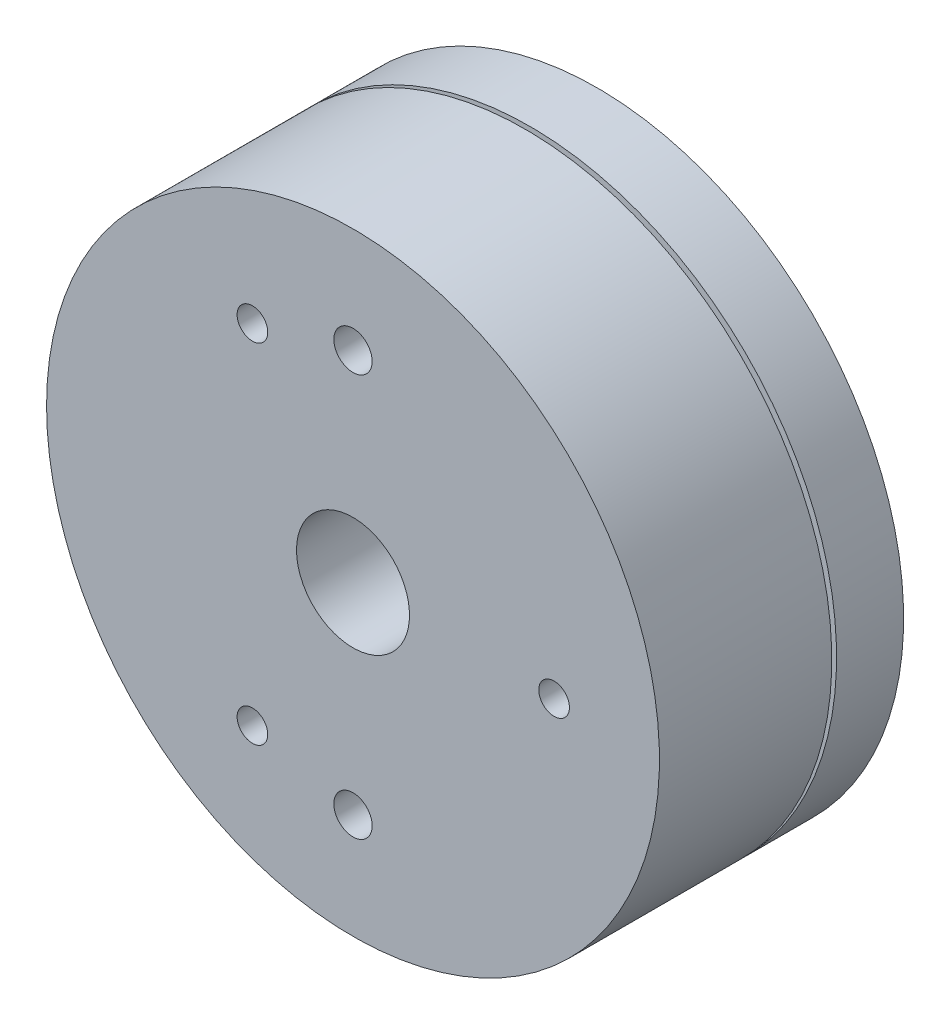
ISO-10303-21;
HEADER;
FILE_DESCRIPTION(('STEP AP214'),'2;1');
FILE_NAME('part.step','',(''),(''),'','','');
FILE_SCHEMA(('AUTOMOTIVE_DESIGN { 1 0 10303 214 1 1 1 1 }'));
ENDSEC;
DATA;
#1=APPLICATION_CONTEXT('core data for automotive mechanical design processes');
#2=APPLICATION_PROTOCOL_DEFINITION('international standard','automotive_design',2000,#1);
#3=PRODUCT_CONTEXT('',#1,'mechanical');
#4=PRODUCT('Part','Part','',(#3));
#5=PRODUCT_RELATED_PRODUCT_CATEGORY('part','',(#4));
#6=PRODUCT_DEFINITION_FORMATION('','',#4);
#7=PRODUCT_DEFINITION_CONTEXT('part definition',#1,'design');
#8=PRODUCT_DEFINITION('design','',#6,#7);
#9=PRODUCT_DEFINITION_SHAPE('','',#8);
#10=(LENGTH_UNIT() NAMED_UNIT(*) SI_UNIT(.MILLI.,.METRE.));
#11=(NAMED_UNIT(*) PLANE_ANGLE_UNIT() SI_UNIT($,.RADIAN.));
#12=(NAMED_UNIT(*) SI_UNIT($,.STERADIAN.) SOLID_ANGLE_UNIT());
#13=UNCERTAINTY_MEASURE_WITH_UNIT(LENGTH_MEASURE(1.E-05),#10,'distance_accuracy_value','');
#14=(GEOMETRIC_REPRESENTATION_CONTEXT(3) GLOBAL_UNCERTAINTY_ASSIGNED_CONTEXT((#13)) GLOBAL_UNIT_ASSIGNED_CONTEXT((#10,
#11,#12)) REPRESENTATION_CONTEXT('',''));
#15=CARTESIAN_POINT('',(0.,0.,0.));
#16=DIRECTION('',(0.,0.,1.));
#17=DIRECTION('',(1.,0.,0.));
#18=AXIS2_PLACEMENT_3D('',#15,#16,#17);
#19=CARTESIAN_POINT('',(0.,0.,3.75));
#20=DIRECTION('',(0.,0.,1.));
#21=DIRECTION('',(1.,0.,0.));
#22=AXIS2_PLACEMENT_3D('',#19,#20,#21);
#23=PLANE('',#22);
#24=CARTESIAN_POINT('',(0.,0.,3.75));
#25=DIRECTION('',(0.,0.,1.));
#26=DIRECTION('',(1.,0.,0.));
#27=AXIS2_PLACEMENT_3D('',#24,#25,#26);
#28=CIRCLE('',#27,5.75);
#29=CARTESIAN_POINT('',(-5.75,0.,3.75));
#30=VERTEX_POINT('',#29);
#31=EDGE_CURVE('P0_E182',#30,#30,#28,.T.);
#32=ORIENTED_EDGE('',*,*,#31,.T.);
#33=EDGE_LOOP('',(#32));
#34=FACE_BOUND('',#33,.T.);
#35=CARTESIAN_POINT('',(0.,-10.5,3.75));
#36=DIRECTION('',(0.,0.,1.));
#37=DIRECTION('',(1.,0.,0.));
#38=AXIS2_PLACEMENT_3D('',#35,#36,#37);
#39=CIRCLE('',#38,1.);
#40=CARTESIAN_POINT('',(-1.,-10.5,3.75));
#41=VERTEX_POINT('',#40);
#42=EDGE_CURVE('P0_E178',#41,#41,#39,.T.);
#43=ORIENTED_EDGE('',*,*,#42,.T.);
#44=EDGE_LOOP('',(#43));
#45=FACE_BOUND('',#44,.T.);
#46=CARTESIAN_POINT('',(0.,10.5,3.75));
#47=DIRECTION('',(0.,0.,1.));
#48=DIRECTION('',(1.,0.,0.));
#49=AXIS2_PLACEMENT_3D('',#46,#47,#48);
#50=CIRCLE('',#49,1.);
#51=CARTESIAN_POINT('',(-1.,10.5,3.75));
#52=VERTEX_POINT('',#51);
#53=EDGE_CURVE('P0_E135',#52,#52,#50,.T.);
#54=ORIENTED_EDGE('',*,*,#53,.T.);
#55=EDGE_LOOP('',(#54));
#56=FACE_BOUND('',#55,.T.);
#57=CARTESIAN_POINT('',(10.5,0.,3.75));
#58=DIRECTION('',(0.,0.,1.));
#59=DIRECTION('',(1.,0.,0.));
#60=AXIS2_PLACEMENT_3D('',#57,#58,#59);
#61=CIRCLE('',#60,0.8);
#62=CARTESIAN_POINT('',(9.7,0.,3.75));
#63=VERTEX_POINT('',#62);
#64=EDGE_CURVE('P0_E126',#63,#63,#61,.T.);
#65=ORIENTED_EDGE('',*,*,#64,.T.);
#66=EDGE_LOOP('',(#65));
#67=FACE_BOUND('',#66,.T.);
#68=CARTESIAN_POINT('',(-5.25,9.09326673973662,3.75));
#69=DIRECTION('',(0.,0.,1.));
#70=DIRECTION('',(1.,0.,0.));
#71=AXIS2_PLACEMENT_3D('',#68,#69,#70);
#72=CIRCLE('',#71,0.8);
#73=CARTESIAN_POINT('',(-6.05,9.09326673973662,3.75));
#74=VERTEX_POINT('',#73);
#75=EDGE_CURVE('P0_E139',#74,#74,#72,.T.);
#76=ORIENTED_EDGE('',*,*,#75,.T.);
#77=EDGE_LOOP('',(#76));
#78=FACE_BOUND('',#77,.T.);
#79=CARTESIAN_POINT('',(-5.25,-9.09326673973659,3.75));
#80=DIRECTION('',(0.,0.,1.));
#81=DIRECTION('',(1.,0.,0.));
#82=AXIS2_PLACEMENT_3D('',#79,#80,#81);
#83=CIRCLE('',#82,0.8);
#84=CARTESIAN_POINT('',(-6.05,-9.09326673973659,3.75));
#85=VERTEX_POINT('',#84);
#86=EDGE_CURVE('P0_E109',#85,#85,#83,.T.);
#87=ORIENTED_EDGE('',*,*,#86,.T.);
#88=EDGE_LOOP('',(#87));
#89=FACE_BOUND('',#88,.T.);
#90=CARTESIAN_POINT('',(0.,0.,3.75));
#91=DIRECTION('',(0.,0.,-1.));
#92=DIRECTION('',(1.,0.,0.));
#93=AXIS2_PLACEMENT_3D('',#90,#91,#92);
#94=CIRCLE('',#93,16.);
#95=CARTESIAN_POINT('',(-16.,0.,3.75));
#96=VERTEX_POINT('',#95);
#97=EDGE_CURVE('P0_E140',#96,#96,#94,.T.);
#98=ORIENTED_EDGE('',*,*,#97,.T.);
#99=EDGE_LOOP('',(#98));
#100=FACE_BOUND('',#99,.T.);
#101=ADVANCED_FACE('P0_F16',(#34,#45,#56,#67,#78,#89,#100),#23,.F.);
#102=CARTESIAN_POINT('',(0.,0.,12.75));
#103=DIRECTION('',(0.,0.,1.));
#104=DIRECTION('',(1.,0.,0.));
#105=AXIS2_PLACEMENT_3D('',#102,#103,#104);
#106=PLANE('',#105);
#107=CARTESIAN_POINT('',(0.,-10.5,12.75));
#108=DIRECTION('',(0.,0.,-1.));
#109=DIRECTION('',(1.,0.,0.));
#110=AXIS2_PLACEMENT_3D('',#107,#108,#109);
#111=CIRCLE('',#110,1.);
#112=CARTESIAN_POINT('',(-1.,-10.5,12.75));
#113=VERTEX_POINT('',#112);
#114=EDGE_CURVE('P0_E150',#113,#113,#111,.T.);
#115=ORIENTED_EDGE('',*,*,#114,.T.);
#116=EDGE_LOOP('',(#115));
#117=FACE_BOUND('',#116,.T.);
#118=CARTESIAN_POINT('',(0.,10.5,12.75));
#119=DIRECTION('',(0.,0.,-1.));
#120=DIRECTION('',(1.,0.,0.));
#121=AXIS2_PLACEMENT_3D('',#118,#119,#120);
#122=CIRCLE('',#121,1.);
#123=CARTESIAN_POINT('',(-1.,10.5,12.75));
#124=VERTEX_POINT('',#123);
#125=EDGE_CURVE('P0_E131',#124,#124,#122,.T.);
#126=ORIENTED_EDGE('',*,*,#125,.T.);
#127=EDGE_LOOP('',(#126));
#128=FACE_BOUND('',#127,.T.);
#129=CARTESIAN_POINT('',(10.5,0.,12.75));
#130=DIRECTION('',(0.,0.,-1.));
#131=DIRECTION('',(1.,0.,0.));
#132=AXIS2_PLACEMENT_3D('',#129,#130,#131);
#133=CIRCLE('',#132,0.8);
#134=CARTESIAN_POINT('',(9.7,0.,12.75));
#135=VERTEX_POINT('',#134);
#136=EDGE_CURVE('P0_E100',#135,#135,#133,.T.);
#137=ORIENTED_EDGE('',*,*,#136,.T.);
#138=EDGE_LOOP('',(#137));
#139=FACE_BOUND('',#138,.T.);
#140=CARTESIAN_POINT('',(-5.25,9.09326673973662,12.75));
#141=DIRECTION('',(0.,0.,-1.));
#142=DIRECTION('',(1.,0.,0.));
#143=AXIS2_PLACEMENT_3D('',#140,#141,#142);
#144=CIRCLE('',#143,0.8);
#145=CARTESIAN_POINT('',(-6.05,9.09326673973662,12.75));
#146=VERTEX_POINT('',#145);
#147=EDGE_CURVE('P0_E115',#146,#146,#144,.T.);
#148=ORIENTED_EDGE('',*,*,#147,.T.);
#149=EDGE_LOOP('',(#148));
#150=FACE_BOUND('',#149,.T.);
#151=CARTESIAN_POINT('',(-5.25,-9.09326673973659,12.75));
#152=DIRECTION('',(0.,0.,-1.));
#153=DIRECTION('',(1.,0.,0.));
#154=AXIS2_PLACEMENT_3D('',#151,#152,#153);
#155=CIRCLE('',#154,0.8);
#156=CARTESIAN_POINT('',(-6.05,-9.09326673973659,12.75));
#157=VERTEX_POINT('',#156);
#158=EDGE_CURVE('P0_E110',#157,#157,#155,.T.);
#159=ORIENTED_EDGE('',*,*,#158,.T.);
#160=EDGE_LOOP('',(#159));
#161=FACE_BOUND('',#160,.T.);
#162=CARTESIAN_POINT('',(0.,0.,12.75));
#163=DIRECTION('',(0.,0.,-1.));
#164=DIRECTION('',(1.,0.,0.));
#165=AXIS2_PLACEMENT_3D('',#162,#163,#164);
#166=CIRCLE('',#165,2.95);
#167=CARTESIAN_POINT('',(-2.95,0.,12.75));
#168=VERTEX_POINT('',#167);
#169=EDGE_CURVE('P0_E148',#168,#168,#166,.T.);
#170=ORIENTED_EDGE('',*,*,#169,.T.);
#171=EDGE_LOOP('',(#170));
#172=FACE_BOUND('',#171,.T.);
#173=CARTESIAN_POINT('',(0.,0.,12.75));
#174=DIRECTION('',(0.,0.,1.));
#175=DIRECTION('',(1.,0.,0.));
#176=AXIS2_PLACEMENT_3D('',#173,#174,#175);
#177=CIRCLE('',#176,16.);
#178=CARTESIAN_POINT('',(-16.,0.,12.75));
#179=VERTEX_POINT('',#178);
#180=EDGE_CURVE('P0_E11',#179,#179,#177,.T.);
#181=ORIENTED_EDGE('',*,*,#180,.T.);
#182=EDGE_LOOP('',(#181));
#183=FACE_BOUND('',#182,.T.);
#184=ADVANCED_FACE('P0_F193',(#117,#128,#139,#150,#161,#172,#183),#106,.T.);
#185=CARTESIAN_POINT('',(0.,0.,12.75));
#186=DIRECTION('',(0.,0.,-1.));
#187=DIRECTION('',(1.,0.,0.));
#188=AXIS2_PLACEMENT_3D('',#185,#186,#187);
#189=CYLINDRICAL_SURFACE('',#188,16.);
#190=ORIENTED_EDGE('',*,*,#97,.F.);
#191=DIRECTION('',(0.,0.,1.));
#192=VECTOR('',#191,1.);
#193=CARTESIAN_POINT('',(-16.,0.,12.75));
#194=LINE('',#193,#192);
#195=EDGE_CURVE('P0_E27',#96,#179,#194,.T.);
#196=ORIENTED_EDGE('',*,*,#195,.T.);
#197=ORIENTED_EDGE('',*,*,#180,.F.);
#198=ORIENTED_EDGE('',*,*,#195,.F.);
#199=EDGE_LOOP('',(#190,#196,#197,#198));
#200=FACE_BOUND('',#199,.T.);
#201=ADVANCED_FACE('P0_F191',(#200),#189,.T.);
#202=CARTESIAN_POINT('',(-5.25,-9.09326673973659,12.75));
#203=DIRECTION('',(0.,0.,-1.));
#204=DIRECTION('',(1.,0.,0.));
#205=AXIS2_PLACEMENT_3D('',#202,#203,#204);
#206=CYLINDRICAL_SURFACE('',#205,0.8);
#207=ORIENTED_EDGE('',*,*,#86,.F.);
#208=DIRECTION('',(0.,0.,1.));
#209=VECTOR('',#208,1.);
#210=CARTESIAN_POINT('',(-6.05,-9.09326673973659,12.75));
#211=LINE('',#210,#209);
#212=EDGE_CURVE('P0_E20',#85,#157,#211,.T.);
#213=ORIENTED_EDGE('',*,*,#212,.T.);
#214=ORIENTED_EDGE('',*,*,#158,.F.);
#215=ORIENTED_EDGE('',*,*,#212,.F.);
#216=EDGE_LOOP('',(#207,#213,#214,#215));
#217=FACE_BOUND('',#216,.T.);
#218=ADVANCED_FACE('P0_F18',(#217),#206,.F.);
#219=CARTESIAN_POINT('',(-5.25,9.09326673973662,12.75));
#220=DIRECTION('',(0.,0.,-1.));
#221=DIRECTION('',(1.,0.,0.));
#222=AXIS2_PLACEMENT_3D('',#219,#220,#221);
#223=CYLINDRICAL_SURFACE('',#222,0.8);
#224=ORIENTED_EDGE('',*,*,#75,.F.);
#225=DIRECTION('',(0.,0.,1.));
#226=VECTOR('',#225,1.);
#227=CARTESIAN_POINT('',(-6.05,9.09326673973662,12.75));
#228=LINE('',#227,#226);
#229=EDGE_CURVE('P0_E90',#74,#146,#228,.T.);
#230=ORIENTED_EDGE('',*,*,#229,.T.);
#231=ORIENTED_EDGE('',*,*,#147,.F.);
#232=ORIENTED_EDGE('',*,*,#229,.F.);
#233=EDGE_LOOP('',(#224,#230,#231,#232));
#234=FACE_BOUND('',#233,.T.);
#235=ADVANCED_FACE('P0_F216',(#234),#223,.F.);
#236=CARTESIAN_POINT('',(10.5,0.,12.75));
#237=DIRECTION('',(0.,0.,-1.));
#238=DIRECTION('',(1.,0.,0.));
#239=AXIS2_PLACEMENT_3D('',#236,#237,#238);
#240=CYLINDRICAL_SURFACE('',#239,0.8);
#241=ORIENTED_EDGE('',*,*,#64,.F.);
#242=DIRECTION('',(0.,0.,1.));
#243=VECTOR('',#242,1.);
#244=CARTESIAN_POINT('',(9.7,0.,12.75));
#245=LINE('',#244,#243);
#246=EDGE_CURVE('P0_E130',#63,#135,#245,.T.);
#247=ORIENTED_EDGE('',*,*,#246,.T.);
#248=ORIENTED_EDGE('',*,*,#136,.F.);
#249=ORIENTED_EDGE('',*,*,#246,.F.);
#250=EDGE_LOOP('',(#241,#247,#248,#249));
#251=FACE_BOUND('',#250,.T.);
#252=ADVANCED_FACE('P0_F211',(#251),#240,.F.);
#253=CARTESIAN_POINT('',(0.,10.5,12.75));
#254=DIRECTION('',(0.,0.,-1.));
#255=DIRECTION('',(1.,0.,0.));
#256=AXIS2_PLACEMENT_3D('',#253,#254,#255);
#257=CYLINDRICAL_SURFACE('',#256,1.);
#258=ORIENTED_EDGE('',*,*,#53,.F.);
#259=DIRECTION('',(0.,0.,1.));
#260=VECTOR('',#259,1.);
#261=CARTESIAN_POINT('',(-1.,10.5,12.75));
#262=LINE('',#261,#260);
#263=EDGE_CURVE('P0_E132',#52,#124,#262,.T.);
#264=ORIENTED_EDGE('',*,*,#263,.T.);
#265=ORIENTED_EDGE('',*,*,#125,.F.);
#266=ORIENTED_EDGE('',*,*,#263,.F.);
#267=EDGE_LOOP('',(#258,#264,#265,#266));
#268=FACE_BOUND('',#267,.T.);
#269=ADVANCED_FACE('P0_F165',(#268),#257,.F.);
#270=CARTESIAN_POINT('',(0.,-10.5,12.75));
#271=DIRECTION('',(0.,0.,-1.));
#272=DIRECTION('',(1.,0.,0.));
#273=AXIS2_PLACEMENT_3D('',#270,#271,#272);
#274=CYLINDRICAL_SURFACE('',#273,1.);
#275=ORIENTED_EDGE('',*,*,#42,.F.);
#276=DIRECTION('',(0.,0.,1.));
#277=VECTOR('',#276,1.);
#278=CARTESIAN_POINT('',(-1.,-10.5,12.75));
#279=LINE('',#278,#277);
#280=EDGE_CURVE('P0_E153',#41,#113,#279,.T.);
#281=ORIENTED_EDGE('',*,*,#280,.T.);
#282=ORIENTED_EDGE('',*,*,#114,.F.);
#283=ORIENTED_EDGE('',*,*,#280,.F.);
#284=EDGE_LOOP('',(#275,#281,#282,#283));
#285=FACE_BOUND('',#284,.T.);
#286=ADVANCED_FACE('P0_F210',(#285),#274,.F.);
#287=CARTESIAN_POINT('',(0.,0.,-2.25));
#288=DIRECTION('',(0.,0.,1.));
#289=DIRECTION('',(1.,0.,0.));
#290=AXIS2_PLACEMENT_3D('',#287,#288,#289);
#291=PLANE('',#290);
#292=CARTESIAN_POINT('',(0.,0.,-2.25));
#293=DIRECTION('',(0.,0.,1.));
#294=DIRECTION('',(1.,0.,0.));
#295=AXIS2_PLACEMENT_3D('',#292,#293,#294);
#296=CIRCLE('',#295,2.95);
#297=CARTESIAN_POINT('',(-2.95,0.,-2.25));
#298=VERTEX_POINT('',#297);
#299=EDGE_CURVE('P0_E149',#298,#298,#296,.T.);
#300=ORIENTED_EDGE('',*,*,#299,.T.);
#301=EDGE_LOOP('',(#300));
#302=FACE_BOUND('',#301,.T.);
#303=CARTESIAN_POINT('',(0.,0.,-2.25));
#304=DIRECTION('',(0.,0.,-1.));
#305=DIRECTION('',(1.,0.,0.));
#306=AXIS2_PLACEMENT_3D('',#303,#304,#305);
#307=CIRCLE('',#306,5.75);
#308=CARTESIAN_POINT('',(-5.75,0.,-2.25));
#309=VERTEX_POINT('',#308);
#310=EDGE_CURVE('P0_E154',#309,#309,#307,.T.);
#311=ORIENTED_EDGE('',*,*,#310,.T.);
#312=EDGE_LOOP('',(#311));
#313=FACE_BOUND('',#312,.T.);
#314=ADVANCED_FACE('P0_F221',(#302,#313),#291,.F.);
#315=CARTESIAN_POINT('',(0.,0.,12.75));
#316=DIRECTION('',(0.,0.,-1.));
#317=DIRECTION('',(1.,0.,0.));
#318=AXIS2_PLACEMENT_3D('',#315,#316,#317);
#319=CYLINDRICAL_SURFACE('',#318,2.95);
#320=ORIENTED_EDGE('',*,*,#299,.F.);
#321=DIRECTION('',(0.,0.,1.));
#322=VECTOR('',#321,1.);
#323=CARTESIAN_POINT('',(-2.95,0.,12.75));
#324=LINE('',#323,#322);
#325=EDGE_CURVE('P0_E144',#298,#168,#324,.T.);
#326=ORIENTED_EDGE('',*,*,#325,.T.);
#327=ORIENTED_EDGE('',*,*,#169,.F.);
#328=ORIENTED_EDGE('',*,*,#325,.F.);
#329=EDGE_LOOP('',(#320,#326,#327,#328));
#330=FACE_BOUND('',#329,.T.);
#331=ADVANCED_FACE('P0_F218',(#330),#319,.F.);
#332=CARTESIAN_POINT('',(0.,0.,12.75));
#333=DIRECTION('',(0.,0.,-1.));
#334=DIRECTION('',(1.,0.,0.));
#335=AXIS2_PLACEMENT_3D('',#332,#333,#334);
#336=CYLINDRICAL_SURFACE('',#335,5.75);
#337=ORIENTED_EDGE('',*,*,#310,.F.);
#338=DIRECTION('',(0.,0.,1.));
#339=VECTOR('',#338,1.);
#340=CARTESIAN_POINT('',(-5.75,0.,12.75));
#341=LINE('',#340,#339);
#342=EDGE_CURVE('P0_E123',#309,#30,#341,.T.);
#343=ORIENTED_EDGE('',*,*,#342,.T.);
#344=ORIENTED_EDGE('',*,*,#31,.F.);
#345=ORIENTED_EDGE('',*,*,#342,.F.);
#346=EDGE_LOOP('',(#337,#343,#344,#345));
#347=FACE_BOUND('',#346,.T.);
#348=ADVANCED_FACE('P0_F205',(#347),#336,.T.);
#349=CLOSED_SHELL('',(#101,#184,#201,#218,#235,#252,#269,#286,#314,#331,#348));
#350=MANIFOLD_SOLID_BREP('P0_B1',#349);
#351=CARTESIAN_POINT('',(0.,0.,0.));
#352=DIRECTION('',(0.,0.,1.));
#353=DIRECTION('',(1.,0.,0.));
#354=AXIS2_PLACEMENT_3D('',#351,#352,#353);
#355=PLANE('',#354);
#356=DIRECTION('',(0.,-1.,0.));
#357=VECTOR('',#356,1.);
#358=CARTESIAN_POINT('',(-9.,4.,0.));
#359=LINE('',#358,#357);
#360=CARTESIAN_POINT('',(-9.,4.,0.));
#361=VERTEX_POINT('',#360);
#362=CARTESIAN_POINT('',(-9.,-4.,0.));
#363=VERTEX_POINT('',#362);
#364=EDGE_CURVE('P1_E71',#361,#363,#359,.T.);
#365=ORIENTED_EDGE('',*,*,#364,.F.);
#366=DIRECTION('',(1.,0.,0.));
#367=VECTOR('',#366,1.);
#368=CARTESIAN_POINT('',(-12.3,4.,0.));
#369=LINE('',#368,#367);
#370=CARTESIAN_POINT('',(-12.3,4.,0.));
#371=VERTEX_POINT('',#370);
#372=EDGE_CURVE('P1_E146',#371,#361,#369,.T.);
#373=ORIENTED_EDGE('',*,*,#372,.F.);
#374=DIRECTION('',(0.,1.,0.));
#375=VECTOR('',#374,1.);
#376=CARTESIAN_POINT('',(-12.3,-4.,0.));
#377=LINE('',#376,#375);
#378=CARTESIAN_POINT('',(-12.3,-4.,0.));
#379=VERTEX_POINT('',#378);
#380=EDGE_CURVE('P1_E61',#379,#371,#377,.T.);
#381=ORIENTED_EDGE('',*,*,#380,.F.);
#382=DIRECTION('',(-1.,0.,0.));
#383=VECTOR('',#382,1.);
#384=CARTESIAN_POINT('',(-9.,-4.,0.));
#385=LINE('',#384,#383);
#386=EDGE_CURVE('P1_E172',#363,#379,#385,.T.);
#387=ORIENTED_EDGE('',*,*,#386,.F.);
#388=EDGE_LOOP('',(#365,#373,#381,#387));
#389=FACE_BOUND('',#388,.T.);
#390=CARTESIAN_POINT('',(0.,0.,0.));
#391=DIRECTION('',(0.,0.,-1.));
#392=DIRECTION('',(1.,0.,0.));
#393=AXIS2_PLACEMENT_3D('',#390,#391,#392);
#394=CIRCLE('',#393,5.75);
#395=CARTESIAN_POINT('',(-5.75,0.,0.));
#396=VERTEX_POINT('',#395);
#397=EDGE_CURVE('P1_E129',#396,#396,#394,.T.);
#398=ORIENTED_EDGE('',*,*,#397,.F.);
#399=EDGE_LOOP('',(#398));
#400=FACE_BOUND('',#399,.T.);
#401=CARTESIAN_POINT('',(-5.12542701473155,8.87749999999934,0.));
#402=DIRECTION('',(0.,0.,-1.));
#403=DIRECTION('',(1.,0.,0.));
#404=AXIS2_PLACEMENT_3D('',#401,#402,#403);
#405=CIRCLE('',#404,0.8);
#406=CARTESIAN_POINT('',(-5.92542701473155,8.87749999999934,0.));
#407=VERTEX_POINT('',#406);
#408=EDGE_CURVE('P1_E123',#407,#407,#405,.T.);
#409=ORIENTED_EDGE('',*,*,#408,.F.);
#410=EDGE_LOOP('',(#409));
#411=FACE_BOUND('',#410,.T.);
#412=CARTESIAN_POINT('',(10.2508540294616,0.,0.));
#413=DIRECTION('',(0.,0.,-1.));
#414=DIRECTION('',(1.,0.,0.));
#415=AXIS2_PLACEMENT_3D('',#412,#413,#414);
#416=CIRCLE('',#415,0.8);
#417=CARTESIAN_POINT('',(9.45085402946155,0.,0.));
#418=VERTEX_POINT('',#417);
#419=EDGE_CURVE('P1_E206',#418,#418,#416,.T.);
#420=ORIENTED_EDGE('',*,*,#419,.F.);
#421=EDGE_LOOP('',(#420));
#422=FACE_BOUND('',#421,.T.);
#423=CARTESIAN_POINT('',(-5.12542701473078,-8.87750000000066,0.));
#424=DIRECTION('',(0.,0.,-1.));
#425=DIRECTION('',(1.,0.,0.));
#426=AXIS2_PLACEMENT_3D('',#423,#424,#425);
#427=CIRCLE('',#426,0.8);
#428=CARTESIAN_POINT('',(-5.92542701473078,-8.87750000000066,0.));
#429=VERTEX_POINT('',#428);
#430=EDGE_CURVE('P1_E152',#429,#429,#427,.T.);
#431=ORIENTED_EDGE('',*,*,#430,.F.);
#432=EDGE_LOOP('',(#431));
#433=FACE_BOUND('',#432,.T.);
#434=CARTESIAN_POINT('',(0.,0.,0.));
#435=DIRECTION('',(0.,0.,1.));
#436=DIRECTION('',(1.,0.,0.));
#437=AXIS2_PLACEMENT_3D('',#434,#435,#436);
#438=CIRCLE('',#437,16.);
#439=CARTESIAN_POINT('',(-16.,0.,0.));
#440=VERTEX_POINT('',#439);
#441=EDGE_CURVE('P1_E11',#440,#440,#438,.T.);
#442=ORIENTED_EDGE('',*,*,#441,.F.);
#443=EDGE_LOOP('',(#442));
#444=FACE_BOUND('',#443,.T.);
#445=ADVANCED_FACE('P1_F16',(#389,#400,#411,#422,#433,#444),#355,.F.);
#446=CARTESIAN_POINT('',(0.,0.,3.5));
#447=DIRECTION('',(0.,0.,1.));
#448=DIRECTION('',(1.,0.,0.));
#449=AXIS2_PLACEMENT_3D('',#446,#447,#448);
#450=PLANE('',#449);
#451=DIRECTION('',(0.,-1.,0.));
#452=VECTOR('',#451,1.);
#453=CARTESIAN_POINT('',(-9.,4.,3.5));
#454=LINE('',#453,#452);
#455=CARTESIAN_POINT('',(-9.,4.,3.5));
#456=VERTEX_POINT('',#455);
#457=CARTESIAN_POINT('',(-9.,-4.,3.5));
#458=VERTEX_POINT('',#457);
#459=EDGE_CURVE('P1_E151',#456,#458,#454,.T.);
#460=ORIENTED_EDGE('',*,*,#459,.T.);
#461=DIRECTION('',(-1.,0.,0.));
#462=VECTOR('',#461,1.);
#463=CARTESIAN_POINT('',(-9.,-4.,3.5));
#464=LINE('',#463,#462);
#465=CARTESIAN_POINT('',(-12.3,-4.,3.5));
#466=VERTEX_POINT('',#465);
#467=EDGE_CURVE('P1_E168',#458,#466,#464,.T.);
#468=ORIENTED_EDGE('',*,*,#467,.T.);
#469=DIRECTION('',(0.,1.,0.));
#470=VECTOR('',#469,1.);
#471=CARTESIAN_POINT('',(-12.3,-4.,3.5));
#472=LINE('',#471,#470);
#473=CARTESIAN_POINT('',(-12.3,4.,3.5));
#474=VERTEX_POINT('',#473);
#475=EDGE_CURVE('P1_E20',#466,#474,#472,.T.);
#476=ORIENTED_EDGE('',*,*,#475,.T.);
#477=DIRECTION('',(1.,0.,0.));
#478=VECTOR('',#477,1.);
#479=CARTESIAN_POINT('',(-12.3,4.,3.5));
#480=LINE('',#479,#478);
#481=EDGE_CURVE('P1_E145',#474,#456,#480,.T.);
#482=ORIENTED_EDGE('',*,*,#481,.T.);
#483=EDGE_LOOP('',(#460,#468,#476,#482));
#484=FACE_BOUND('',#483,.T.);
#485=CARTESIAN_POINT('',(0.,0.,3.5));
#486=DIRECTION('',(0.,0.,-1.));
#487=DIRECTION('',(1.,0.,0.));
#488=AXIS2_PLACEMENT_3D('',#485,#486,#487);
#489=CIRCLE('',#488,5.75);
#490=CARTESIAN_POINT('',(-5.75,0.,3.5));
#491=VERTEX_POINT('',#490);
#492=EDGE_CURVE('P1_E147',#491,#491,#489,.T.);
#493=ORIENTED_EDGE('',*,*,#492,.T.);
#494=EDGE_LOOP('',(#493));
#495=FACE_BOUND('',#494,.T.);
#496=CARTESIAN_POINT('',(-5.12542701473155,8.87749999999934,3.5));
#497=DIRECTION('',(0.,0.,-1.));
#498=DIRECTION('',(1.,0.,0.));
#499=AXIS2_PLACEMENT_3D('',#496,#497,#498);
#500=CIRCLE('',#499,0.8);
#501=CARTESIAN_POINT('',(-5.92542701473155,8.87749999999934,3.5));
#502=VERTEX_POINT('',#501);
#503=EDGE_CURVE('P1_E121',#502,#502,#500,.T.);
#504=ORIENTED_EDGE('',*,*,#503,.T.);
#505=EDGE_LOOP('',(#504));
#506=FACE_BOUND('',#505,.T.);
#507=CARTESIAN_POINT('',(10.2508540294616,0.,3.5));
#508=DIRECTION('',(0.,0.,-1.));
#509=DIRECTION('',(1.,0.,0.));
#510=AXIS2_PLACEMENT_3D('',#507,#508,#509);
#511=CIRCLE('',#510,0.8);
#512=CARTESIAN_POINT('',(9.45085402946155,0.,3.5));
#513=VERTEX_POINT('',#512);
#514=EDGE_CURVE('P1_E163',#513,#513,#511,.T.);
#515=ORIENTED_EDGE('',*,*,#514,.T.);
#516=EDGE_LOOP('',(#515));
#517=FACE_BOUND('',#516,.T.);
#518=CARTESIAN_POINT('',(-5.12542701473078,-8.87750000000066,3.5));
#519=DIRECTION('',(0.,0.,-1.));
#520=DIRECTION('',(1.,0.,0.));
#521=AXIS2_PLACEMENT_3D('',#518,#519,#520);
#522=CIRCLE('',#521,0.8);
#523=CARTESIAN_POINT('',(-5.92542701473078,-8.87750000000066,3.5));
#524=VERTEX_POINT('',#523);
#525=EDGE_CURVE('P1_E162',#524,#524,#522,.T.);
#526=ORIENTED_EDGE('',*,*,#525,.T.);
#527=EDGE_LOOP('',(#526));
#528=FACE_BOUND('',#527,.T.);
#529=CARTESIAN_POINT('',(0.,0.,3.5));
#530=DIRECTION('',(0.,0.,1.));
#531=DIRECTION('',(1.,0.,0.));
#532=AXIS2_PLACEMENT_3D('',#529,#530,#531);
#533=CIRCLE('',#532,16.);
#534=CARTESIAN_POINT('',(-16.,0.,3.5));
#535=VERTEX_POINT('',#534);
#536=EDGE_CURVE('P1_E155',#535,#535,#533,.T.);
#537=ORIENTED_EDGE('',*,*,#536,.T.);
#538=EDGE_LOOP('',(#537));
#539=FACE_BOUND('',#538,.T.);
#540=ADVANCED_FACE('P1_F18',(#484,#495,#506,#517,#528,#539),#450,.T.);
#541=CARTESIAN_POINT('',(0.,0.,0.));
#542=DIRECTION('',(0.,0.,1.));
#543=DIRECTION('',(1.,0.,0.));
#544=AXIS2_PLACEMENT_3D('',#541,#542,#543);
#545=CYLINDRICAL_SURFACE('',#544,16.);
#546=ORIENTED_EDGE('',*,*,#536,.F.);
#547=DIRECTION('',(0.,0.,-1.));
#548=VECTOR('',#547,1.);
#549=CARTESIAN_POINT('',(-16.,0.,0.));
#550=LINE('',#549,#548);
#551=EDGE_CURVE('P1_E27',#535,#440,#550,.T.);
#552=ORIENTED_EDGE('',*,*,#551,.T.);
#553=ORIENTED_EDGE('',*,*,#441,.T.);
#554=ORIENTED_EDGE('',*,*,#551,.F.);
#555=EDGE_LOOP('',(#546,#552,#553,#554));
#556=FACE_BOUND('',#555,.T.);
#557=ADVANCED_FACE('P1_F179',(#556),#545,.T.);
#558=CARTESIAN_POINT('',(-5.12542701473078,-8.87750000000066,0.));
#559=DIRECTION('',(0.,0.,1.));
#560=DIRECTION('',(1.,0.,0.));
#561=AXIS2_PLACEMENT_3D('',#558,#559,#560);
#562=CYLINDRICAL_SURFACE('',#561,0.8);
#563=ORIENTED_EDGE('',*,*,#525,.F.);
#564=DIRECTION('',(0.,0.,-1.));
#565=VECTOR('',#564,1.);
#566=CARTESIAN_POINT('',(-5.92542701473078,-8.87750000000066,0.));
#567=LINE('',#566,#565);
#568=EDGE_CURVE('P1_E156',#524,#429,#567,.T.);
#569=ORIENTED_EDGE('',*,*,#568,.T.);
#570=ORIENTED_EDGE('',*,*,#430,.T.);
#571=ORIENTED_EDGE('',*,*,#568,.F.);
#572=EDGE_LOOP('',(#563,#569,#570,#571));
#573=FACE_BOUND('',#572,.T.);
#574=ADVANCED_FACE('P1_F189',(#573),#562,.F.);
#575=CARTESIAN_POINT('',(10.2508540294616,0.,0.));
#576=DIRECTION('',(0.,0.,1.));
#577=DIRECTION('',(1.,0.,0.));
#578=AXIS2_PLACEMENT_3D('',#575,#576,#577);
#579=CYLINDRICAL_SURFACE('',#578,0.8);
#580=ORIENTED_EDGE('',*,*,#514,.F.);
#581=DIRECTION('',(0.,0.,-1.));
#582=VECTOR('',#581,1.);
#583=CARTESIAN_POINT('',(9.45085402946155,0.,0.));
#584=LINE('',#583,#582);
#585=EDGE_CURVE('P1_E167',#513,#418,#584,.T.);
#586=ORIENTED_EDGE('',*,*,#585,.T.);
#587=ORIENTED_EDGE('',*,*,#419,.T.);
#588=ORIENTED_EDGE('',*,*,#585,.F.);
#589=EDGE_LOOP('',(#580,#586,#587,#588));
#590=FACE_BOUND('',#589,.T.);
#591=ADVANCED_FACE('P1_F258',(#590),#579,.F.);
#592=CARTESIAN_POINT('',(-5.12542701473155,8.87749999999934,0.));
#593=DIRECTION('',(0.,0.,1.));
#594=DIRECTION('',(1.,0.,0.));
#595=AXIS2_PLACEMENT_3D('',#592,#593,#594);
#596=CYLINDRICAL_SURFACE('',#595,0.8);
#597=ORIENTED_EDGE('',*,*,#503,.F.);
#598=DIRECTION('',(0.,0.,-1.));
#599=VECTOR('',#598,1.);
#600=CARTESIAN_POINT('',(-5.92542701473155,8.87749999999934,0.));
#601=LINE('',#600,#599);
#602=EDGE_CURVE('P1_E118',#502,#407,#601,.T.);
#603=ORIENTED_EDGE('',*,*,#602,.T.);
#604=ORIENTED_EDGE('',*,*,#408,.T.);
#605=ORIENTED_EDGE('',*,*,#602,.F.);
#606=EDGE_LOOP('',(#597,#603,#604,#605));
#607=FACE_BOUND('',#606,.T.);
#608=ADVANCED_FACE('P1_F120',(#607),#596,.F.);
#609=CARTESIAN_POINT('',(0.,0.,0.));
#610=DIRECTION('',(0.,0.,1.));
#611=DIRECTION('',(1.,0.,0.));
#612=AXIS2_PLACEMENT_3D('',#609,#610,#611);
#613=CYLINDRICAL_SURFACE('',#612,5.75);
#614=ORIENTED_EDGE('',*,*,#492,.F.);
#615=DIRECTION('',(0.,0.,-1.));
#616=VECTOR('',#615,1.);
#617=CARTESIAN_POINT('',(-5.75,0.,0.));
#618=LINE('',#617,#616);
#619=EDGE_CURVE('P1_E135',#491,#396,#618,.T.);
#620=ORIENTED_EDGE('',*,*,#619,.T.);
#621=ORIENTED_EDGE('',*,*,#397,.T.);
#622=ORIENTED_EDGE('',*,*,#619,.F.);
#623=EDGE_LOOP('',(#614,#620,#621,#622));
#624=FACE_BOUND('',#623,.T.);
#625=ADVANCED_FACE('P1_F199',(#624),#613,.F.);
#626=CARTESIAN_POINT('',(-9.,4.,0.));
#627=DIRECTION('',(-1.,0.,0.));
#628=DIRECTION('',(0.,0.,1.));
#629=AXIS2_PLACEMENT_3D('',#626,#627,#628);
#630=PLANE('',#629);
#631=ORIENTED_EDGE('',*,*,#364,.T.);
#632=DIRECTION('',(0.,0.,1.));
#633=VECTOR('',#632,1.);
#634=CARTESIAN_POINT('',(-9.,-4.,0.));
#635=LINE('',#634,#633);
#636=EDGE_CURVE('P1_E171',#363,#458,#635,.T.);
#637=ORIENTED_EDGE('',*,*,#636,.T.);
#638=ORIENTED_EDGE('',*,*,#459,.F.);
#639=DIRECTION('',(0.,0.,1.));
#640=VECTOR('',#639,1.);
#641=CARTESIAN_POINT('',(-9.,4.,0.));
#642=LINE('',#641,#640);
#643=EDGE_CURVE('P1_E141',#361,#456,#642,.T.);
#644=ORIENTED_EDGE('',*,*,#643,.F.);
#645=EDGE_LOOP('',(#631,#637,#638,#644));
#646=FACE_BOUND('',#645,.T.);
#647=ADVANCED_FACE('P1_F268',(#646),#630,.T.);
#648=CARTESIAN_POINT('',(-9.,-4.,0.));
#649=DIRECTION('',(0.,1.,0.));
#650=DIRECTION('',(1.,0.,0.));
#651=AXIS2_PLACEMENT_3D('',#648,#649,#650);
#652=PLANE('',#651);
#653=ORIENTED_EDGE('',*,*,#386,.T.);
#654=DIRECTION('',(0.,0.,1.));
#655=VECTOR('',#654,1.);
#656=CARTESIAN_POINT('',(-12.3,-4.,0.));
#657=LINE('',#656,#655);
#658=EDGE_CURVE('P1_E212',#379,#466,#657,.T.);
#659=ORIENTED_EDGE('',*,*,#658,.T.);
#660=ORIENTED_EDGE('',*,*,#467,.F.);
#661=ORIENTED_EDGE('',*,*,#636,.F.);
#662=EDGE_LOOP('',(#653,#659,#660,#661));
#663=FACE_BOUND('',#662,.T.);
#664=ADVANCED_FACE('P1_F246',(#663),#652,.T.);
#665=CARTESIAN_POINT('',(-12.3,-4.,0.));
#666=DIRECTION('',(1.,0.,0.));
#667=DIRECTION('',(0.,1.,0.));
#668=AXIS2_PLACEMENT_3D('',#665,#666,#667);
#669=PLANE('',#668);
#670=ORIENTED_EDGE('',*,*,#380,.T.);
#671=DIRECTION('',(0.,0.,1.));
#672=VECTOR('',#671,1.);
#673=CARTESIAN_POINT('',(-12.3,4.,0.));
#674=LINE('',#673,#672);
#675=EDGE_CURVE('P1_E138',#371,#474,#674,.T.);
#676=ORIENTED_EDGE('',*,*,#675,.T.);
#677=ORIENTED_EDGE('',*,*,#475,.F.);
#678=ORIENTED_EDGE('',*,*,#658,.F.);
#679=EDGE_LOOP('',(#670,#676,#677,#678));
#680=FACE_BOUND('',#679,.T.);
#681=ADVANCED_FACE('P1_F240',(#680),#669,.T.);
#682=CARTESIAN_POINT('',(-12.3,4.,0.));
#683=DIRECTION('',(0.,-1.,0.));
#684=DIRECTION('',(0.,0.,-1.));
#685=AXIS2_PLACEMENT_3D('',#682,#683,#684);
#686=PLANE('',#685);
#687=ORIENTED_EDGE('',*,*,#372,.T.);
#688=ORIENTED_EDGE('',*,*,#643,.T.);
#689=ORIENTED_EDGE('',*,*,#481,.F.);
#690=ORIENTED_EDGE('',*,*,#675,.F.);
#691=EDGE_LOOP('',(#687,#688,#689,#690));
#692=FACE_BOUND('',#691,.T.);
#693=ADVANCED_FACE('P1_F242',(#692),#686,.T.);
#694=CLOSED_SHELL('',(#445,#540,#557,#574,#591,#608,#625,#647,#664,#681,#693));
#695=MANIFOLD_SOLID_BREP('P1_B1',#694);
#696=ADVANCED_BREP_SHAPE_REPRESENTATION('',(#18,#350,#695),#14);
#697=SHAPE_DEFINITION_REPRESENTATION(#9,#696);
ENDSEC;
END-ISO-10303-21;
